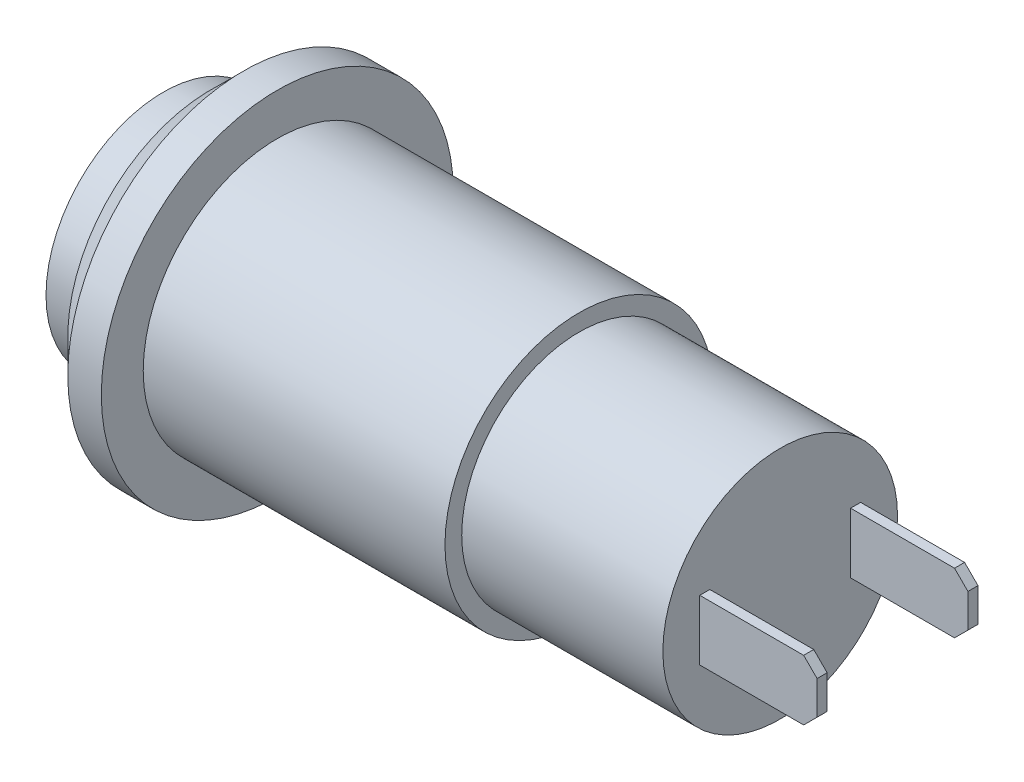
ISO-10303-21;
HEADER;
FILE_DESCRIPTION(('STEP AP214'),'2;1');
FILE_NAME('part.step','',(''),(''),'','','');
FILE_SCHEMA(('AUTOMOTIVE_DESIGN { 1 0 10303 214 1 1 1 1 }'));
ENDSEC;
DATA;
#1=APPLICATION_CONTEXT('core data for automotive mechanical design processes');
#2=APPLICATION_PROTOCOL_DEFINITION('international standard','automotive_design',2000,#1);
#3=PRODUCT_CONTEXT('',#1,'mechanical');
#4=PRODUCT('Part','Part','',(#3));
#5=PRODUCT_RELATED_PRODUCT_CATEGORY('part','',(#4));
#6=PRODUCT_DEFINITION_FORMATION('','',#4);
#7=PRODUCT_DEFINITION_CONTEXT('part definition',#1,'design');
#8=PRODUCT_DEFINITION('design','',#6,#7);
#9=PRODUCT_DEFINITION_SHAPE('','',#8);
#10=(LENGTH_UNIT() NAMED_UNIT(*) SI_UNIT(.MILLI.,.METRE.));
#11=(NAMED_UNIT(*) PLANE_ANGLE_UNIT() SI_UNIT($,.RADIAN.));
#12=(NAMED_UNIT(*) SI_UNIT($,.STERADIAN.) SOLID_ANGLE_UNIT());
#13=UNCERTAINTY_MEASURE_WITH_UNIT(LENGTH_MEASURE(1.E-05),#10,'distance_accuracy_value','');
#14=(GEOMETRIC_REPRESENTATION_CONTEXT(3) GLOBAL_UNCERTAINTY_ASSIGNED_CONTEXT((#13)) GLOBAL_UNIT_ASSIGNED_CONTEXT((#10,
#11,#12)) REPRESENTATION_CONTEXT('',''));
#15=CARTESIAN_POINT('',(0.,0.,0.));
#16=DIRECTION('',(0.,0.,1.));
#17=DIRECTION('',(1.,0.,0.));
#18=AXIS2_PLACEMENT_3D('',#15,#16,#17);
#19=CARTESIAN_POINT('',(18.4,3.5,0.));
#20=DIRECTION('',(-1.,0.,0.));
#21=DIRECTION('',(0.,0.,1.));
#22=AXIS2_PLACEMENT_3D('',#19,#20,#21);
#23=PLANE('',#22);
#24=DIRECTION('',(0.,-1.,0.));
#25=VECTOR('',#24,1.);
#26=CARTESIAN_POINT('',(18.4,-0.9,2.4));
#27=LINE('',#26,#25);
#28=CARTESIAN_POINT('',(18.4,0.9,2.4));
#29=VERTEX_POINT('',#28);
#30=CARTESIAN_POINT('',(18.4,-0.9,2.4));
#31=VERTEX_POINT('',#30);
#32=EDGE_CURVE('E181',#29,#31,#27,.T.);
#33=ORIENTED_EDGE('',*,*,#32,.F.);
#34=DIRECTION('',(0.,0.,1.));
#35=VECTOR('',#34,1.);
#36=CARTESIAN_POINT('',(18.4,0.9,2.1));
#37=LINE('',#36,#35);
#38=CARTESIAN_POINT('',(18.4,0.9,2.1));
#39=VERTEX_POINT('',#38);
#40=EDGE_CURVE('E187',#39,#29,#37,.T.);
#41=ORIENTED_EDGE('',*,*,#40,.F.);
#42=DIRECTION('',(0.,1.,0.));
#43=VECTOR('',#42,1.);
#44=CARTESIAN_POINT('',(18.4,-0.9,2.1));
#45=LINE('',#44,#43);
#46=CARTESIAN_POINT('',(18.4,-0.900000000000001,2.1));
#47=VERTEX_POINT('',#46);
#48=EDGE_CURVE('E199',#47,#39,#45,.T.);
#49=ORIENTED_EDGE('',*,*,#48,.F.);
#50=DIRECTION('',(0.,0.,-1.));
#51=VECTOR('',#50,1.);
#52=CARTESIAN_POINT('',(18.4,-0.9,2.1));
#53=LINE('',#52,#51);
#54=EDGE_CURVE('E195',#31,#47,#53,.T.);
#55=ORIENTED_EDGE('',*,*,#54,.F.);
#56=EDGE_LOOP('',(#33,#41,#49,#55));
#57=FACE_BOUND('',#56,.T.);
#58=CARTESIAN_POINT('',(18.4,0.,0.));
#59=DIRECTION('',(-1.,0.,0.));
#60=DIRECTION('',(0.,0.,1.));
#61=AXIS2_PLACEMENT_3D('',#58,#59,#60);
#62=CIRCLE('',#61,3.5);
#63=CARTESIAN_POINT('',(18.4,0.,3.5));
#64=VERTEX_POINT('',#63);
#65=EDGE_CURVE('E217',#64,#64,#62,.T.);
#66=ORIENTED_EDGE('',*,*,#65,.F.);
#67=EDGE_LOOP('',(#66));
#68=FACE_BOUND('',#67,.T.);
#69=DIRECTION('',(0.,-1.,0.));
#70=VECTOR('',#69,1.);
#71=CARTESIAN_POINT('',(18.4,-0.899999999999999,-2.1));
#72=LINE('',#71,#70);
#73=CARTESIAN_POINT('',(18.4,0.900000000000001,-2.1));
#74=VERTEX_POINT('',#73);
#75=CARTESIAN_POINT('',(18.4,-0.899999999999999,-2.1));
#76=VERTEX_POINT('',#75);
#77=EDGE_CURVE('E140',#74,#76,#72,.T.);
#78=ORIENTED_EDGE('',*,*,#77,.F.);
#79=DIRECTION('',(0.,0.,1.));
#80=VECTOR('',#79,1.);
#81=CARTESIAN_POINT('',(18.4,0.900000000000001,-2.4));
#82=LINE('',#81,#80);
#83=CARTESIAN_POINT('',(18.4,0.900000000000001,-2.4));
#84=VERTEX_POINT('',#83);
#85=EDGE_CURVE('E154',#84,#74,#82,.T.);
#86=ORIENTED_EDGE('',*,*,#85,.F.);
#87=DIRECTION('',(0.,1.,0.));
#88=VECTOR('',#87,1.);
#89=CARTESIAN_POINT('',(18.4,-0.899999999999999,-2.4));
#90=LINE('',#89,#88);
#91=CARTESIAN_POINT('',(18.4,-0.899999999999999,-2.4));
#92=VERTEX_POINT('',#91);
#93=EDGE_CURVE('E164',#92,#84,#90,.T.);
#94=ORIENTED_EDGE('',*,*,#93,.F.);
#95=DIRECTION('',(0.,0.,-1.));
#96=VECTOR('',#95,1.);
#97=CARTESIAN_POINT('',(18.4,-0.899999999999999,-2.4));
#98=LINE('',#97,#96);
#99=EDGE_CURVE('E157',#76,#92,#98,.T.);
#100=ORIENTED_EDGE('',*,*,#99,.F.);
#101=EDGE_LOOP('',(#78,#86,#94,#100));
#102=FACE_BOUND('',#101,.T.);
#103=ADVANCED_FACE('F45',(#57,#68,#102),#23,.F.);
#104=CARTESIAN_POINT('',(0.,0.,0.));
#105=DIRECTION('',(1.,0.,0.));
#106=DIRECTION('',(0.,0.,-1.));
#107=AXIS2_PLACEMENT_3D('',#104,#105,#106);
#108=PLANE('',#107);
#109=CARTESIAN_POINT('',(0.,0.,0.));
#110=DIRECTION('',(-1.,0.,0.));
#111=DIRECTION('',(0.,0.,1.));
#112=AXIS2_PLACEMENT_3D('',#109,#110,#111);
#113=CIRCLE('',#112,3.5);
#114=CARTESIAN_POINT('',(0.,0.,3.5));
#115=VERTEX_POINT('',#114);
#116=EDGE_CURVE('E241',#115,#115,#113,.T.);
#117=ORIENTED_EDGE('',*,*,#116,.T.);
#118=EDGE_LOOP('',(#117));
#119=FACE_BOUND('',#118,.T.);
#120=ADVANCED_FACE('F326',(#119),#108,.F.);
#121=CARTESIAN_POINT('',(-10.9846153846154,0.,0.));
#122=DIRECTION('',(-1.,0.,0.));
#123=DIRECTION('',(0.,0.,1.));
#124=AXIS2_PLACEMENT_3D('',#121,#122,#123);
#125=CYLINDRICAL_SURFACE('',#124,3.5);
#126=ORIENTED_EDGE('',*,*,#116,.F.);
#127=EDGE_LOOP('',(#126));
#128=FACE_BOUND('',#127,.T.);
#129=CARTESIAN_POINT('',(1.4,0.,0.));
#130=DIRECTION('',(-1.,0.,0.));
#131=DIRECTION('',(0.,0.,1.));
#132=AXIS2_PLACEMENT_3D('',#129,#130,#131);
#133=CIRCLE('',#132,3.5);
#134=CARTESIAN_POINT('',(1.4,0.,3.5));
#135=VERTEX_POINT('',#134);
#136=EDGE_CURVE('E237',#135,#135,#133,.T.);
#137=ORIENTED_EDGE('',*,*,#136,.T.);
#138=EDGE_LOOP('',(#137));
#139=FACE_BOUND('',#138,.T.);
#140=ADVANCED_FACE('F331',(#128,#139),#125,.T.);
#141=CARTESIAN_POINT('',(1.4,3.5,0.));
#142=DIRECTION('',(1.,0.,0.));
#143=DIRECTION('',(0.,0.,-1.));
#144=AXIS2_PLACEMENT_3D('',#141,#142,#143);
#145=PLANE('',#144);
#146=CARTESIAN_POINT('',(1.4,0.,0.));
#147=DIRECTION('',(1.,0.,0.));
#148=DIRECTION('',(0.,0.,-1.));
#149=AXIS2_PLACEMENT_3D('',#146,#147,#148);
#150=CIRCLE('',#149,4.25);
#151=CARTESIAN_POINT('',(1.4,0.,-4.25));
#152=VERTEX_POINT('',#151);
#153=EDGE_CURVE('E245',#152,#152,#150,.F.);
#154=ORIENTED_EDGE('',*,*,#153,.T.);
#155=EDGE_LOOP('',(#154));
#156=FACE_BOUND('',#155,.T.);
#157=ORIENTED_EDGE('',*,*,#136,.F.);
#158=EDGE_LOOP('',(#157));
#159=FACE_BOUND('',#158,.T.);
#160=ADVANCED_FACE('F357',(#156,#159),#145,.F.);
#161=CARTESIAN_POINT('',(-10.9846153846154,0.,0.));
#162=DIRECTION('',(-1.,0.,0.));
#163=DIRECTION('',(0.,0.,1.));
#164=AXIS2_PLACEMENT_3D('',#161,#162,#163);
#165=CYLINDRICAL_SURFACE('',#164,5.25);
#166=CARTESIAN_POINT('',(2.4,0.,0.));
#167=DIRECTION('',(1.,0.,0.));
#168=DIRECTION('',(0.,0.,-1.));
#169=AXIS2_PLACEMENT_3D('',#166,#167,#168);
#170=CIRCLE('',#169,5.25);
#171=CARTESIAN_POINT('',(2.4,0.,-5.25));
#172=VERTEX_POINT('',#171);
#173=EDGE_CURVE('E249',#172,#172,#170,.T.);
#174=ORIENTED_EDGE('',*,*,#173,.T.);
#175=EDGE_LOOP('',(#174));
#176=FACE_BOUND('',#175,.T.);
#177=CARTESIAN_POINT('',(3.4,0.,0.));
#178=DIRECTION('',(-1.,0.,0.));
#179=DIRECTION('',(0.,0.,1.));
#180=AXIS2_PLACEMENT_3D('',#177,#178,#179);
#181=CIRCLE('',#180,5.25);
#182=CARTESIAN_POINT('',(3.4,0.,5.25));
#183=VERTEX_POINT('',#182);
#184=EDGE_CURVE('E233',#183,#183,#181,.T.);
#185=ORIENTED_EDGE('',*,*,#184,.T.);
#186=EDGE_LOOP('',(#185));
#187=FACE_BOUND('',#186,.T.);
#188=ADVANCED_FACE('F353',(#176,#187),#165,.T.);
#189=CARTESIAN_POINT('',(3.4,5.25,0.));
#190=DIRECTION('',(-1.,0.,0.));
#191=DIRECTION('',(0.,0.,1.));
#192=AXIS2_PLACEMENT_3D('',#189,#190,#191);
#193=PLANE('',#192);
#194=ORIENTED_EDGE('',*,*,#184,.F.);
#195=EDGE_LOOP('',(#194));
#196=FACE_BOUND('',#195,.T.);
#197=CARTESIAN_POINT('',(3.4,0.,0.));
#198=DIRECTION('',(-1.,0.,0.));
#199=DIRECTION('',(0.,0.,1.));
#200=AXIS2_PLACEMENT_3D('',#197,#198,#199);
#201=CIRCLE('',#200,4.);
#202=CARTESIAN_POINT('',(3.4,0.,4.));
#203=VERTEX_POINT('',#202);
#204=EDGE_CURVE('E229',#203,#203,#201,.T.);
#205=ORIENTED_EDGE('',*,*,#204,.T.);
#206=EDGE_LOOP('',(#205));
#207=FACE_BOUND('',#206,.T.);
#208=ADVANCED_FACE('F349',(#196,#207),#193,.F.);
#209=CARTESIAN_POINT('',(-10.9846153846154,0.,0.));
#210=DIRECTION('',(-1.,0.,0.));
#211=DIRECTION('',(0.,0.,1.));
#212=AXIS2_PLACEMENT_3D('',#209,#210,#211);
#213=CYLINDRICAL_SURFACE('',#212,4.);
#214=ORIENTED_EDGE('',*,*,#204,.F.);
#215=EDGE_LOOP('',(#214));
#216=FACE_BOUND('',#215,.T.);
#217=CARTESIAN_POINT('',(12.4,0.,0.));
#218=DIRECTION('',(-1.,0.,0.));
#219=DIRECTION('',(0.,0.,1.));
#220=AXIS2_PLACEMENT_3D('',#217,#218,#219);
#221=CIRCLE('',#220,4.);
#222=CARTESIAN_POINT('',(12.4,0.,4.));
#223=VERTEX_POINT('',#222);
#224=EDGE_CURVE('E225',#223,#223,#221,.T.);
#225=ORIENTED_EDGE('',*,*,#224,.T.);
#226=EDGE_LOOP('',(#225));
#227=FACE_BOUND('',#226,.T.);
#228=ADVANCED_FACE('F345',(#216,#227),#213,.T.);
#229=CARTESIAN_POINT('',(12.4,4.,0.));
#230=DIRECTION('',(-1.,0.,0.));
#231=DIRECTION('',(0.,0.,1.));
#232=AXIS2_PLACEMENT_3D('',#229,#230,#231);
#233=PLANE('',#232);
#234=ORIENTED_EDGE('',*,*,#224,.F.);
#235=EDGE_LOOP('',(#234));
#236=FACE_BOUND('',#235,.T.);
#237=CARTESIAN_POINT('',(12.4,0.,0.));
#238=DIRECTION('',(-1.,0.,0.));
#239=DIRECTION('',(0.,0.,1.));
#240=AXIS2_PLACEMENT_3D('',#237,#238,#239);
#241=CIRCLE('',#240,3.5);
#242=CARTESIAN_POINT('',(12.4,0.,3.5));
#243=VERTEX_POINT('',#242);
#244=EDGE_CURVE('E221',#243,#243,#241,.T.);
#245=ORIENTED_EDGE('',*,*,#244,.T.);
#246=EDGE_LOOP('',(#245));
#247=FACE_BOUND('',#246,.T.);
#248=ADVANCED_FACE('F341',(#236,#247),#233,.F.);
#249=CARTESIAN_POINT('',(-10.9846153846154,0.,0.));
#250=DIRECTION('',(-1.,0.,0.));
#251=DIRECTION('',(0.,0.,1.));
#252=AXIS2_PLACEMENT_3D('',#249,#250,#251);
#253=CYLINDRICAL_SURFACE('',#252,3.5);
#254=ORIENTED_EDGE('',*,*,#244,.F.);
#255=EDGE_LOOP('',(#254));
#256=FACE_BOUND('',#255,.T.);
#257=ORIENTED_EDGE('',*,*,#65,.T.);
#258=EDGE_LOOP('',(#257));
#259=FACE_BOUND('',#258,.T.);
#260=ADVANCED_FACE('F337',(#256,#259),#253,.T.);
#261=CARTESIAN_POINT('',(1.4,0.,0.));
#262=DIRECTION('',(1.,0.,0.));
#263=DIRECTION('',(0.,0.,-1.));
#264=AXIS2_PLACEMENT_3D('',#261,#262,#263);
#265=CONICAL_SURFACE('',#264,4.25,0.785398163397447);
#266=ORIENTED_EDGE('',*,*,#173,.F.);
#267=EDGE_LOOP('',(#266));
#268=FACE_BOUND('',#267,.T.);
#269=ORIENTED_EDGE('',*,*,#153,.F.);
#270=EDGE_LOOP('',(#269));
#271=FACE_BOUND('',#270,.T.);
#272=ADVANCED_FACE('F340',(#268,#271),#265,.T.);
#273=CARTESIAN_POINT('',(21.9,-0.9,2.4));
#274=DIRECTION('',(0.,0.,-1.));
#275=DIRECTION('',(-1.,0.,0.));
#276=AXIS2_PLACEMENT_3D('',#273,#274,#275);
#277=PLANE('',#276);
#278=DIRECTION('',(-1.,0.,0.));
#279=VECTOR('',#278,1.);
#280=CARTESIAN_POINT('',(21.9,-0.9,2.4));
#281=LINE('',#280,#279);
#282=CARTESIAN_POINT('',(21.5,-0.9,2.4));
#283=VERTEX_POINT('',#282);
#284=EDGE_CURVE('E214',#283,#31,#281,.T.);
#285=ORIENTED_EDGE('',*,*,#284,.F.);
#286=DIRECTION('',(0.707106781186548,0.707106781186548,0.));
#287=VECTOR('',#286,1.);
#288=CARTESIAN_POINT('',(21.9,-0.499999999999999,2.4));
#289=LINE('',#288,#287);
#290=CARTESIAN_POINT('',(21.9,-0.499999999999999,2.4));
#291=VERTEX_POINT('',#290);
#292=EDGE_CURVE('E55',#283,#291,#289,.T.);
#293=ORIENTED_EDGE('',*,*,#292,.T.);
#294=DIRECTION('',(0.,-1.,0.));
#295=VECTOR('',#294,1.);
#296=CARTESIAN_POINT('',(21.9,-0.9,2.4));
#297=LINE('',#296,#295);
#298=CARTESIAN_POINT('',(21.9,0.499999999999999,2.4));
#299=VERTEX_POINT('',#298);
#300=EDGE_CURVE('E182',#299,#291,#297,.T.);
#301=ORIENTED_EDGE('',*,*,#300,.F.);
#302=DIRECTION('',(-0.707106781186548,0.707106781186548,0.));
#303=VECTOR('',#302,1.);
#304=CARTESIAN_POINT('',(21.9,0.499999999999999,2.4));
#305=LINE('',#304,#303);
#306=CARTESIAN_POINT('',(21.5,0.9,2.4));
#307=VERTEX_POINT('',#306);
#308=EDGE_CURVE('E62',#299,#307,#305,.T.);
#309=ORIENTED_EDGE('',*,*,#308,.T.);
#310=DIRECTION('',(-1.,0.,0.));
#311=VECTOR('',#310,1.);
#312=CARTESIAN_POINT('',(21.9,0.9,2.4));
#313=LINE('',#312,#311);
#314=EDGE_CURVE('E191',#307,#29,#313,.T.);
#315=ORIENTED_EDGE('',*,*,#314,.T.);
#316=ORIENTED_EDGE('',*,*,#32,.T.);
#317=EDGE_LOOP('',(#285,#293,#301,#309,#315,#316));
#318=FACE_BOUND('',#317,.T.);
#319=ADVANCED_FACE('F297',(#318),#277,.F.);
#320=CARTESIAN_POINT('',(21.9,-0.9,2.1));
#321=DIRECTION('',(0.,1.,0.));
#322=DIRECTION('',(0.,0.,1.));
#323=AXIS2_PLACEMENT_3D('',#320,#321,#322);
#324=PLANE('',#323);
#325=DIRECTION('',(-1.,0.,0.));
#326=VECTOR('',#325,1.);
#327=CARTESIAN_POINT('',(21.9,-0.9,2.1));
#328=LINE('',#327,#326);
#329=CARTESIAN_POINT('',(21.5,-0.9,2.1));
#330=VERTEX_POINT('',#329);
#331=EDGE_CURVE('E211',#330,#47,#328,.T.);
#332=ORIENTED_EDGE('',*,*,#331,.F.);
#333=DIRECTION('',(0.,0.,1.));
#334=VECTOR('',#333,1.);
#335=CARTESIAN_POINT('',(21.5,-0.9,2.4));
#336=LINE('',#335,#334);
#337=EDGE_CURVE('E70',#330,#283,#336,.T.);
#338=ORIENTED_EDGE('',*,*,#337,.T.);
#339=ORIENTED_EDGE('',*,*,#284,.T.);
#340=ORIENTED_EDGE('',*,*,#54,.T.);
#341=EDGE_LOOP('',(#332,#338,#339,#340));
#342=FACE_BOUND('',#341,.T.);
#343=ADVANCED_FACE('F308',(#342),#324,.F.);
#344=CARTESIAN_POINT('',(21.9,-0.9,2.1));
#345=DIRECTION('',(0.,0.,1.));
#346=DIRECTION('',(1.,0.,0.));
#347=AXIS2_PLACEMENT_3D('',#344,#345,#346);
#348=PLANE('',#347);
#349=DIRECTION('',(0.,1.,0.));
#350=VECTOR('',#349,1.);
#351=CARTESIAN_POINT('',(21.9,-0.9,2.1));
#352=LINE('',#351,#350);
#353=CARTESIAN_POINT('',(21.9,-0.499999999999999,2.1));
#354=VERTEX_POINT('',#353);
#355=CARTESIAN_POINT('',(21.9,0.499999999999999,2.1));
#356=VERTEX_POINT('',#355);
#357=EDGE_CURVE('E186',#354,#356,#352,.T.);
#358=ORIENTED_EDGE('',*,*,#357,.F.);
#359=DIRECTION('',(-0.707106781186548,-0.707106781186548,0.));
#360=VECTOR('',#359,1.);
#361=CARTESIAN_POINT('',(21.9,-0.499999999999999,2.1));
#362=LINE('',#361,#360);
#363=EDGE_CURVE('E289',#354,#330,#362,.T.);
#364=ORIENTED_EDGE('',*,*,#363,.T.);
#365=ORIENTED_EDGE('',*,*,#331,.T.);
#366=ORIENTED_EDGE('',*,*,#48,.T.);
#367=DIRECTION('',(-1.,0.,0.));
#368=VECTOR('',#367,1.);
#369=CARTESIAN_POINT('',(21.9,0.9,2.1));
#370=LINE('',#369,#368);
#371=CARTESIAN_POINT('',(21.5,0.9,2.1));
#372=VERTEX_POINT('',#371);
#373=EDGE_CURVE('E208',#372,#39,#370,.T.);
#374=ORIENTED_EDGE('',*,*,#373,.F.);
#375=DIRECTION('',(0.707106781186548,-0.707106781186548,0.));
#376=VECTOR('',#375,1.);
#377=CARTESIAN_POINT('',(21.9,0.499999999999999,2.1));
#378=LINE('',#377,#376);
#379=EDGE_CURVE('E286',#372,#356,#378,.T.);
#380=ORIENTED_EDGE('',*,*,#379,.T.);
#381=EDGE_LOOP('',(#358,#364,#365,#366,#374,#380));
#382=FACE_BOUND('',#381,.T.);
#383=ADVANCED_FACE('F306',(#382),#348,.F.);
#384=CARTESIAN_POINT('',(21.9,0.9,2.1));
#385=DIRECTION('',(0.,-1.,0.));
#386=DIRECTION('',(0.,0.,-1.));
#387=AXIS2_PLACEMENT_3D('',#384,#385,#386);
#388=PLANE('',#387);
#389=ORIENTED_EDGE('',*,*,#314,.F.);
#390=DIRECTION('',(0.,0.,-1.));
#391=VECTOR('',#390,1.);
#392=CARTESIAN_POINT('',(21.5,0.9,2.1));
#393=LINE('',#392,#391);
#394=EDGE_CURVE('E11',#307,#372,#393,.T.);
#395=ORIENTED_EDGE('',*,*,#394,.T.);
#396=ORIENTED_EDGE('',*,*,#373,.T.);
#397=ORIENTED_EDGE('',*,*,#40,.T.);
#398=EDGE_LOOP('',(#389,#395,#396,#397));
#399=FACE_BOUND('',#398,.T.);
#400=ADVANCED_FACE('F316',(#399),#388,.F.);
#401=CARTESIAN_POINT('',(21.9,0.,0.));
#402=DIRECTION('',(1.,0.,0.));
#403=DIRECTION('',(0.,0.,-1.));
#404=AXIS2_PLACEMENT_3D('',#401,#402,#403);
#405=PLANE('',#404);
#406=ORIENTED_EDGE('',*,*,#300,.T.);
#407=DIRECTION('',(0.,0.,-1.));
#408=VECTOR('',#407,1.);
#409=CARTESIAN_POINT('',(21.9,-0.499999999999999,2.1));
#410=LINE('',#409,#408);
#411=EDGE_CURVE('E282',#291,#354,#410,.T.);
#412=ORIENTED_EDGE('',*,*,#411,.T.);
#413=ORIENTED_EDGE('',*,*,#357,.T.);
#414=DIRECTION('',(0.,0.,1.));
#415=VECTOR('',#414,1.);
#416=CARTESIAN_POINT('',(21.9,0.499999999999999,2.4));
#417=LINE('',#416,#415);
#418=EDGE_CURVE('E278',#356,#299,#417,.T.);
#419=ORIENTED_EDGE('',*,*,#418,.T.);
#420=EDGE_LOOP('',(#406,#412,#413,#419));
#421=FACE_BOUND('',#420,.T.);
#422=ADVANCED_FACE('F301',(#421),#405,.T.);
#423=CARTESIAN_POINT('',(21.9,-0.899999999999999,-2.1));
#424=DIRECTION('',(0.,0.,-1.));
#425=DIRECTION('',(-1.,0.,0.));
#426=AXIS2_PLACEMENT_3D('',#423,#424,#425);
#427=PLANE('',#426);
#428=DIRECTION('',(-1.,0.,0.));
#429=VECTOR('',#428,1.);
#430=CARTESIAN_POINT('',(21.9,-0.899999999999999,-2.1));
#431=LINE('',#430,#429);
#432=CARTESIAN_POINT('',(21.5,-0.899999999999999,-2.1));
#433=VERTEX_POINT('',#432);
#434=EDGE_CURVE('E178',#433,#76,#431,.T.);
#435=ORIENTED_EDGE('',*,*,#434,.F.);
#436=DIRECTION('',(0.707106781186551,0.707106781186544,0.));
#437=VECTOR('',#436,1.);
#438=CARTESIAN_POINT('',(21.9,-0.500000000000002,-2.1));
#439=LINE('',#438,#437);
#440=CARTESIAN_POINT('',(21.9,-0.500000000000002,-2.1));
#441=VERTEX_POINT('',#440);
#442=EDGE_CURVE('E272',#433,#441,#439,.T.);
#443=ORIENTED_EDGE('',*,*,#442,.T.);
#444=DIRECTION('',(0.,-1.,0.));
#445=VECTOR('',#444,1.);
#446=CARTESIAN_POINT('',(21.9,-0.899999999999999,-2.1));
#447=LINE('',#446,#445);
#448=CARTESIAN_POINT('',(21.9,0.5,-2.1));
#449=VERTEX_POINT('',#448);
#450=EDGE_CURVE('E163',#449,#441,#447,.T.);
#451=ORIENTED_EDGE('',*,*,#450,.F.);
#452=DIRECTION('',(-0.707106781186547,0.707106781186548,0.));
#453=VECTOR('',#452,1.);
#454=CARTESIAN_POINT('',(21.9,0.499999999999999,-2.1));
#455=LINE('',#454,#453);
#456=CARTESIAN_POINT('',(21.5,0.900000000000001,-2.1));
#457=VERTEX_POINT('',#456);
#458=EDGE_CURVE('E142',#449,#457,#455,.T.);
#459=ORIENTED_EDGE('',*,*,#458,.T.);
#460=DIRECTION('',(-1.,0.,0.));
#461=VECTOR('',#460,1.);
#462=CARTESIAN_POINT('',(21.9,0.900000000000001,-2.1));
#463=LINE('',#462,#461);
#464=EDGE_CURVE('E136',#457,#74,#463,.T.);
#465=ORIENTED_EDGE('',*,*,#464,.T.);
#466=ORIENTED_EDGE('',*,*,#77,.T.);
#467=EDGE_LOOP('',(#435,#443,#451,#459,#465,#466));
#468=FACE_BOUND('',#467,.T.);
#469=ADVANCED_FACE('F139',(#468),#427,.F.);
#470=CARTESIAN_POINT('',(21.9,-0.899999999999999,-2.4));
#471=DIRECTION('',(0.,1.,0.));
#472=DIRECTION('',(0.,0.,1.));
#473=AXIS2_PLACEMENT_3D('',#470,#471,#472);
#474=PLANE('',#473);
#475=DIRECTION('',(-1.,0.,0.));
#476=VECTOR('',#475,1.);
#477=CARTESIAN_POINT('',(21.9,-0.899999999999999,-2.4));
#478=LINE('',#477,#476);
#479=CARTESIAN_POINT('',(21.5,-0.899999999999999,-2.4));
#480=VERTEX_POINT('',#479);
#481=EDGE_CURVE('E175',#480,#92,#478,.T.);
#482=ORIENTED_EDGE('',*,*,#481,.F.);
#483=DIRECTION('',(0.,0.,1.));
#484=VECTOR('',#483,1.);
#485=CARTESIAN_POINT('',(21.5,-0.899999999999999,-2.1));
#486=LINE('',#485,#484);
#487=EDGE_CURVE('E267',#480,#433,#486,.T.);
#488=ORIENTED_EDGE('',*,*,#487,.T.);
#489=ORIENTED_EDGE('',*,*,#434,.T.);
#490=ORIENTED_EDGE('',*,*,#99,.T.);
#491=EDGE_LOOP('',(#482,#488,#489,#490));
#492=FACE_BOUND('',#491,.T.);
#493=ADVANCED_FACE('F404',(#492),#474,.F.);
#494=CARTESIAN_POINT('',(21.9,-0.899999999999999,-2.4));
#495=DIRECTION('',(0.,0.,1.));
#496=DIRECTION('',(1.,0.,0.));
#497=AXIS2_PLACEMENT_3D('',#494,#495,#496);
#498=PLANE('',#497);
#499=DIRECTION('',(0.,1.,0.));
#500=VECTOR('',#499,1.);
#501=CARTESIAN_POINT('',(21.9,-0.899999999999999,-2.4));
#502=LINE('',#501,#500);
#503=CARTESIAN_POINT('',(21.9,-0.500000000000002,-2.4));
#504=VERTEX_POINT('',#503);
#505=CARTESIAN_POINT('',(21.9,0.5,-2.4));
#506=VERTEX_POINT('',#505);
#507=EDGE_CURVE('E148',#504,#506,#502,.T.);
#508=ORIENTED_EDGE('',*,*,#507,.F.);
#509=DIRECTION('',(-0.707106781186551,-0.707106781186544,0.));
#510=VECTOR('',#509,1.);
#511=CARTESIAN_POINT('',(21.9,-0.500000000000002,-2.4));
#512=LINE('',#511,#510);
#513=EDGE_CURVE('E264',#504,#480,#512,.T.);
#514=ORIENTED_EDGE('',*,*,#513,.T.);
#515=ORIENTED_EDGE('',*,*,#481,.T.);
#516=ORIENTED_EDGE('',*,*,#93,.T.);
#517=DIRECTION('',(-1.,0.,0.));
#518=VECTOR('',#517,1.);
#519=CARTESIAN_POINT('',(21.9,0.900000000000001,-2.4));
#520=LINE('',#519,#518);
#521=CARTESIAN_POINT('',(21.5,0.900000000000001,-2.4));
#522=VERTEX_POINT('',#521);
#523=EDGE_CURVE('E147',#522,#84,#520,.T.);
#524=ORIENTED_EDGE('',*,*,#523,.F.);
#525=DIRECTION('',(0.707106781186547,-0.707106781186548,0.));
#526=VECTOR('',#525,1.);
#527=CARTESIAN_POINT('',(21.9,0.499999999999999,-2.4));
#528=LINE('',#527,#526);
#529=EDGE_CURVE('E261',#522,#506,#528,.T.);
#530=ORIENTED_EDGE('',*,*,#529,.T.);
#531=EDGE_LOOP('',(#508,#514,#515,#516,#524,#530));
#532=FACE_BOUND('',#531,.T.);
#533=ADVANCED_FACE('F396',(#532),#498,.F.);
#534=CARTESIAN_POINT('',(21.9,0.900000000000001,-2.4));
#535=DIRECTION('',(0.,-1.,0.));
#536=DIRECTION('',(0.,0.,-1.));
#537=AXIS2_PLACEMENT_3D('',#534,#535,#536);
#538=PLANE('',#537);
#539=ORIENTED_EDGE('',*,*,#464,.F.);
#540=DIRECTION('',(0.,0.,-1.));
#541=VECTOR('',#540,1.);
#542=CARTESIAN_POINT('',(21.5,0.900000000000001,-2.4));
#543=LINE('',#542,#541);
#544=EDGE_CURVE('E275',#457,#522,#543,.T.);
#545=ORIENTED_EDGE('',*,*,#544,.T.);
#546=ORIENTED_EDGE('',*,*,#523,.T.);
#547=ORIENTED_EDGE('',*,*,#85,.T.);
#548=EDGE_LOOP('',(#539,#545,#546,#547));
#549=FACE_BOUND('',#548,.T.);
#550=ADVANCED_FACE('F160',(#549),#538,.F.);
#551=CARTESIAN_POINT('',(21.9,0.,0.));
#552=DIRECTION('',(1.,0.,0.));
#553=DIRECTION('',(0.,0.,-1.));
#554=AXIS2_PLACEMENT_3D('',#551,#552,#553);
#555=PLANE('',#554);
#556=ORIENTED_EDGE('',*,*,#450,.T.);
#557=DIRECTION('',(0.,0.,-1.));
#558=VECTOR('',#557,1.);
#559=CARTESIAN_POINT('',(21.9,-0.500000000000002,-2.4));
#560=LINE('',#559,#558);
#561=EDGE_CURVE('E257',#441,#504,#560,.T.);
#562=ORIENTED_EDGE('',*,*,#561,.T.);
#563=ORIENTED_EDGE('',*,*,#507,.T.);
#564=DIRECTION('',(0.,0.,1.));
#565=VECTOR('',#564,1.);
#566=CARTESIAN_POINT('',(21.9,0.5,-2.1));
#567=LINE('',#566,#565);
#568=EDGE_CURVE('E253',#506,#449,#567,.T.);
#569=ORIENTED_EDGE('',*,*,#568,.T.);
#570=EDGE_LOOP('',(#556,#562,#563,#569));
#571=FACE_BOUND('',#570,.T.);
#572=ADVANCED_FACE('F378',(#571),#555,.T.);
#573=CARTESIAN_POINT('',(21.9,-0.500000000000002,0.));
#574=DIRECTION('',(0.707106781186544,-0.707106781186551,0.));
#575=DIRECTION('',(0.,0.,1.));
#576=AXIS2_PLACEMENT_3D('',#573,#574,#575);
#577=PLANE('',#576);
#578=ORIENTED_EDGE('',*,*,#442,.F.);
#579=ORIENTED_EDGE('',*,*,#487,.F.);
#580=ORIENTED_EDGE('',*,*,#513,.F.);
#581=ORIENTED_EDGE('',*,*,#561,.F.);
#582=EDGE_LOOP('',(#578,#579,#580,#581));
#583=FACE_BOUND('',#582,.T.);
#584=ADVANCED_FACE('F372',(#583),#577,.T.);
#585=CARTESIAN_POINT('',(21.9,0.499999999999999,0.));
#586=DIRECTION('',(0.707106781186548,0.707106781186547,0.));
#587=DIRECTION('',(0.,0.,-1.));
#588=AXIS2_PLACEMENT_3D('',#585,#586,#587);
#589=PLANE('',#588);
#590=ORIENTED_EDGE('',*,*,#529,.F.);
#591=ORIENTED_EDGE('',*,*,#544,.F.);
#592=ORIENTED_EDGE('',*,*,#458,.F.);
#593=ORIENTED_EDGE('',*,*,#568,.F.);
#594=EDGE_LOOP('',(#590,#591,#592,#593));
#595=FACE_BOUND('',#594,.T.);
#596=ADVANCED_FACE('F324',(#595),#589,.T.);
#597=CARTESIAN_POINT('',(21.9,-0.499999999999999,0.));
#598=DIRECTION('',(0.707106781186547,-0.707106781186547,0.));
#599=DIRECTION('',(0.,0.,1.));
#600=AXIS2_PLACEMENT_3D('',#597,#598,#599);
#601=PLANE('',#600);
#602=ORIENTED_EDGE('',*,*,#292,.F.);
#603=ORIENTED_EDGE('',*,*,#337,.F.);
#604=ORIENTED_EDGE('',*,*,#363,.F.);
#605=ORIENTED_EDGE('',*,*,#411,.F.);
#606=EDGE_LOOP('',(#602,#603,#604,#605));
#607=FACE_BOUND('',#606,.T.);
#608=ADVANCED_FACE('F304',(#607),#601,.T.);
#609=CARTESIAN_POINT('',(21.9,0.499999999999999,0.));
#610=DIRECTION('',(0.707106781186547,0.707106781186547,0.));
#611=DIRECTION('',(0.,0.,-1.));
#612=AXIS2_PLACEMENT_3D('',#609,#610,#611);
#613=PLANE('',#612);
#614=ORIENTED_EDGE('',*,*,#379,.F.);
#615=ORIENTED_EDGE('',*,*,#394,.F.);
#616=ORIENTED_EDGE('',*,*,#308,.F.);
#617=ORIENTED_EDGE('',*,*,#418,.F.);
#618=EDGE_LOOP('',(#614,#615,#616,#617));
#619=FACE_BOUND('',#618,.T.);
#620=ADVANCED_FACE('F48',(#619),#613,.T.);
#621=CLOSED_SHELL('',(#103,#120,#140,#160,#188,#208,#228,#248,#260,#272,#319,#343,#383,#400,
#422,#469,#493,#533,#550,#572,#584,#596,#608,#620));
#622=MANIFOLD_SOLID_BREP('B2',#621);
#623=ADVANCED_BREP_SHAPE_REPRESENTATION('',(#18,#622),#14);
#624=SHAPE_DEFINITION_REPRESENTATION(#9,#623);
ENDSEC;
END-ISO-10303-21;
